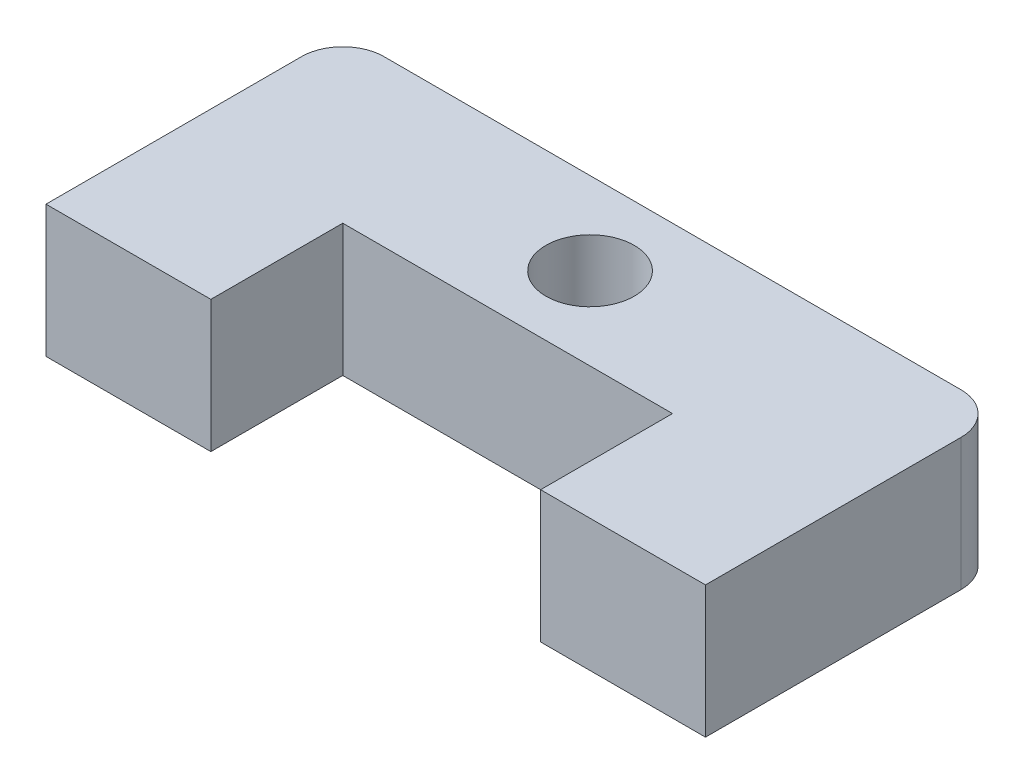
ISO-10303-21;
HEADER;
FILE_DESCRIPTION(('STEP AP214'),'2;1');
FILE_NAME('part.step','',(''),(''),'','','');
FILE_SCHEMA(('AUTOMOTIVE_DESIGN { 1 0 10303 214 1 1 1 1 }'));
ENDSEC;
DATA;
#1=APPLICATION_CONTEXT('core data for automotive mechanical design processes');
#2=APPLICATION_PROTOCOL_DEFINITION('international standard','automotive_design',2000,#1);
#3=PRODUCT_CONTEXT('',#1,'mechanical');
#4=PRODUCT('Part','Part','',(#3));
#5=PRODUCT_RELATED_PRODUCT_CATEGORY('part','',(#4));
#6=PRODUCT_DEFINITION_FORMATION('','',#4);
#7=PRODUCT_DEFINITION_CONTEXT('part definition',#1,'design');
#8=PRODUCT_DEFINITION('design','',#6,#7);
#9=PRODUCT_DEFINITION_SHAPE('','',#8);
#10=(LENGTH_UNIT() NAMED_UNIT(*) SI_UNIT(.MILLI.,.METRE.));
#11=(NAMED_UNIT(*) PLANE_ANGLE_UNIT() SI_UNIT($,.RADIAN.));
#12=(NAMED_UNIT(*) SI_UNIT($,.STERADIAN.) SOLID_ANGLE_UNIT());
#13=UNCERTAINTY_MEASURE_WITH_UNIT(LENGTH_MEASURE(1.E-05),#10,'distance_accuracy_value','');
#14=(GEOMETRIC_REPRESENTATION_CONTEXT(3) GLOBAL_UNCERTAINTY_ASSIGNED_CONTEXT((#13)) GLOBAL_UNIT_ASSIGNED_CONTEXT((#10,
#11,#12)) REPRESENTATION_CONTEXT('',''));
#15=CARTESIAN_POINT('',(0.,0.,0.));
#16=DIRECTION('',(0.,0.,1.));
#17=DIRECTION('',(1.,0.,0.));
#18=AXIS2_PLACEMENT_3D('',#15,#16,#17);
#19=CARTESIAN_POINT('',(0.,5.08,0.));
#20=DIRECTION('',(0.,-1.,0.));
#21=DIRECTION('',(0.,0.,-1.));
#22=AXIS2_PLACEMENT_3D('',#19,#20,#21);
#23=PLANE('',#22);
#24=DIRECTION('',(0.,0.,-1.));
#25=VECTOR('',#24,1.);
#26=CARTESIAN_POINT('',(12.7,5.08,3.175));
#27=LINE('',#26,#25);
#28=CARTESIAN_POINT('',(12.7,5.08,8.255));
#29=VERTEX_POINT('',#28);
#30=CARTESIAN_POINT('',(12.7,5.08,-1.5875));
#31=VERTEX_POINT('',#30);
#32=EDGE_CURVE('E162',#29,#31,#27,.T.);
#33=ORIENTED_EDGE('',*,*,#32,.T.);
#34=CARTESIAN_POINT('',(11.1125,5.08,-1.5875));
#35=DIRECTION('',(0.,-1.,0.));
#36=DIRECTION('',(0.,0.,-1.));
#37=AXIS2_PLACEMENT_3D('',#34,#35,#36);
#38=CIRCLE('',#37,1.5875);
#39=CARTESIAN_POINT('',(11.1125,5.08,-3.175));
#40=VERTEX_POINT('',#39);
#41=EDGE_CURVE('E41',#31,#40,#38,.F.);
#42=ORIENTED_EDGE('',*,*,#41,.T.);
#43=DIRECTION('',(-1.,0.,0.));
#44=VECTOR('',#43,1.);
#45=CARTESIAN_POINT('',(-12.7,5.08,-3.175));
#46=LINE('',#45,#44);
#47=CARTESIAN_POINT('',(-11.1125,5.08,-3.175));
#48=VERTEX_POINT('',#47);
#49=EDGE_CURVE('E117',#40,#48,#46,.T.);
#50=ORIENTED_EDGE('',*,*,#49,.T.);
#51=CARTESIAN_POINT('',(-11.1125,5.08,-1.5875));
#52=DIRECTION('',(0.,-1.,0.));
#53=DIRECTION('',(0.,0.,-1.));
#54=AXIS2_PLACEMENT_3D('',#51,#52,#53);
#55=CIRCLE('',#54,1.5875);
#56=CARTESIAN_POINT('',(-12.7,5.08,-1.5875));
#57=VERTEX_POINT('',#56);
#58=EDGE_CURVE('E48',#48,#57,#55,.F.);
#59=ORIENTED_EDGE('',*,*,#58,.T.);
#60=DIRECTION('',(0.,0.,1.));
#61=VECTOR('',#60,1.);
#62=CARTESIAN_POINT('',(-12.7,5.08,3.175));
#63=LINE('',#62,#61);
#64=CARTESIAN_POINT('',(-12.7,5.08,8.255));
#65=VERTEX_POINT('',#64);
#66=EDGE_CURVE('E109',#57,#65,#63,.T.);
#67=ORIENTED_EDGE('',*,*,#66,.T.);
#68=DIRECTION('',(1.,0.,0.));
#69=VECTOR('',#68,1.);
#70=CARTESIAN_POINT('',(-12.7,5.08,8.255));
#71=LINE('',#70,#69);
#72=CARTESIAN_POINT('',(-6.35,5.08,8.255));
#73=VERTEX_POINT('',#72);
#74=EDGE_CURVE('E113',#65,#73,#71,.T.);
#75=ORIENTED_EDGE('',*,*,#74,.T.);
#76=DIRECTION('',(0.,0.,-1.));
#77=VECTOR('',#76,1.);
#78=CARTESIAN_POINT('',(-6.35,5.08,8.255));
#79=LINE('',#78,#77);
#80=CARTESIAN_POINT('',(-6.35,5.08,3.175));
#81=VERTEX_POINT('',#80);
#82=EDGE_CURVE('E132',#73,#81,#79,.T.);
#83=ORIENTED_EDGE('',*,*,#82,.T.);
#84=DIRECTION('',(1.,0.,0.));
#85=VECTOR('',#84,1.);
#86=CARTESIAN_POINT('',(-6.35,5.08,3.175));
#87=LINE('',#86,#85);
#88=CARTESIAN_POINT('',(6.35,5.08,3.175));
#89=VERTEX_POINT('',#88);
#90=EDGE_CURVE('E134',#81,#89,#87,.T.);
#91=ORIENTED_EDGE('',*,*,#90,.T.);
#92=DIRECTION('',(0.,0.,1.));
#93=VECTOR('',#92,1.);
#94=CARTESIAN_POINT('',(6.35,5.08,3.175));
#95=LINE('',#94,#93);
#96=CARTESIAN_POINT('',(6.35,5.08,8.255));
#97=VERTEX_POINT('',#96);
#98=EDGE_CURVE('E139',#89,#97,#95,.T.);
#99=ORIENTED_EDGE('',*,*,#98,.T.);
#100=DIRECTION('',(1.,0.,0.));
#101=VECTOR('',#100,1.);
#102=CARTESIAN_POINT('',(6.35,5.08,8.255));
#103=LINE('',#102,#101);
#104=EDGE_CURVE('E141',#97,#29,#103,.T.);
#105=ORIENTED_EDGE('',*,*,#104,.T.);
#106=EDGE_LOOP('',(#33,#42,#50,#59,#67,#75,#83,#91,#99,#105));
#107=FACE_BOUND('',#106,.T.);
#108=CARTESIAN_POINT('',(0.,5.08,0.));
#109=DIRECTION('',(0.,1.,0.));
#110=DIRECTION('',(0.,0.,1.));
#111=AXIS2_PLACEMENT_3D('',#108,#109,#110);
#112=CIRCLE('',#111,1.7);
#113=CARTESIAN_POINT('',(0.,5.08,1.7));
#114=VERTEX_POINT('',#113);
#115=EDGE_CURVE('E148',#114,#114,#112,.T.);
#116=ORIENTED_EDGE('',*,*,#115,.F.);
#117=EDGE_LOOP('',(#116));
#118=FACE_BOUND('',#117,.T.);
#119=ADVANCED_FACE('F33',(#107,#118),#23,.F.);
#120=CARTESIAN_POINT('',(0.,0.,0.));
#121=DIRECTION('',(0.,-1.,0.));
#122=DIRECTION('',(0.,0.,-1.));
#123=AXIS2_PLACEMENT_3D('',#120,#121,#122);
#124=PLANE('',#123);
#125=DIRECTION('',(-1.,0.,0.));
#126=VECTOR('',#125,1.);
#127=CARTESIAN_POINT('',(-12.7,0.,-3.175));
#128=LINE('',#127,#126);
#129=CARTESIAN_POINT('',(11.1125,0.,-3.175));
#130=VERTEX_POINT('',#129);
#131=CARTESIAN_POINT('',(-11.1125,0.,-3.175));
#132=VERTEX_POINT('',#131);
#133=EDGE_CURVE('E145',#130,#132,#128,.T.);
#134=ORIENTED_EDGE('',*,*,#133,.F.);
#135=CARTESIAN_POINT('',(11.1125,0.,-1.5875));
#136=DIRECTION('',(0.,-1.,0.));
#137=DIRECTION('',(0.,0.,-1.));
#138=AXIS2_PLACEMENT_3D('',#135,#136,#137);
#139=CIRCLE('',#138,1.5875);
#140=CARTESIAN_POINT('',(12.7,0.,-1.5875));
#141=VERTEX_POINT('',#140);
#142=EDGE_CURVE('E181',#130,#141,#139,.T.);
#143=ORIENTED_EDGE('',*,*,#142,.T.);
#144=DIRECTION('',(0.,0.,-1.));
#145=VECTOR('',#144,1.);
#146=CARTESIAN_POINT('',(12.7,0.,8.255));
#147=LINE('',#146,#145);
#148=CARTESIAN_POINT('',(12.7,0.,8.255));
#149=VERTEX_POINT('',#148);
#150=EDGE_CURVE('E160',#149,#141,#147,.T.);
#151=ORIENTED_EDGE('',*,*,#150,.F.);
#152=DIRECTION('',(1.,0.,0.));
#153=VECTOR('',#152,1.);
#154=CARTESIAN_POINT('',(6.35,0.,8.255));
#155=LINE('',#154,#153);
#156=CARTESIAN_POINT('',(6.35,0.,8.255));
#157=VERTEX_POINT('',#156);
#158=EDGE_CURVE('E158',#157,#149,#155,.T.);
#159=ORIENTED_EDGE('',*,*,#158,.F.);
#160=DIRECTION('',(0.,0.,1.));
#161=VECTOR('',#160,1.);
#162=CARTESIAN_POINT('',(6.35,0.,3.175));
#163=LINE('',#162,#161);
#164=CARTESIAN_POINT('',(6.35,0.,3.175));
#165=VERTEX_POINT('',#164);
#166=EDGE_CURVE('E156',#165,#157,#163,.T.);
#167=ORIENTED_EDGE('',*,*,#166,.F.);
#168=DIRECTION('',(1.,0.,0.));
#169=VECTOR('',#168,1.);
#170=CARTESIAN_POINT('',(-6.35,0.,3.175));
#171=LINE('',#170,#169);
#172=CARTESIAN_POINT('',(-6.35,0.,3.175));
#173=VERTEX_POINT('',#172);
#174=EDGE_CURVE('E154',#173,#165,#171,.T.);
#175=ORIENTED_EDGE('',*,*,#174,.F.);
#176=DIRECTION('',(0.,0.,-1.));
#177=VECTOR('',#176,1.);
#178=CARTESIAN_POINT('',(-6.35,0.,8.255));
#179=LINE('',#178,#177);
#180=CARTESIAN_POINT('',(-6.35,0.,8.255));
#181=VERTEX_POINT('',#180);
#182=EDGE_CURVE('E152',#181,#173,#179,.T.);
#183=ORIENTED_EDGE('',*,*,#182,.F.);
#184=DIRECTION('',(1.,0.,0.));
#185=VECTOR('',#184,1.);
#186=CARTESIAN_POINT('',(-12.7,0.,8.255));
#187=LINE('',#186,#185);
#188=CARTESIAN_POINT('',(-12.7,0.,8.255));
#189=VERTEX_POINT('',#188);
#190=EDGE_CURVE('E150',#189,#181,#187,.T.);
#191=ORIENTED_EDGE('',*,*,#190,.F.);
#192=DIRECTION('',(0.,0.,1.));
#193=VECTOR('',#192,1.);
#194=CARTESIAN_POINT('',(-12.7,0.,3.175));
#195=LINE('',#194,#193);
#196=CARTESIAN_POINT('',(-12.7,0.,-1.5875));
#197=VERTEX_POINT('',#196);
#198=EDGE_CURVE('E123',#197,#189,#195,.T.);
#199=ORIENTED_EDGE('',*,*,#198,.F.);
#200=CARTESIAN_POINT('',(-11.1125,0.,-1.5875));
#201=DIRECTION('',(0.,-1.,0.));
#202=DIRECTION('',(0.,0.,-1.));
#203=AXIS2_PLACEMENT_3D('',#200,#201,#202);
#204=CIRCLE('',#203,1.5875);
#205=EDGE_CURVE('E179',#197,#132,#204,.T.);
#206=ORIENTED_EDGE('',*,*,#205,.T.);
#207=EDGE_LOOP('',(#134,#143,#151,#159,#167,#175,#183,#191,#199,#206));
#208=FACE_BOUND('',#207,.T.);
#209=CARTESIAN_POINT('',(0.,0.,0.));
#210=DIRECTION('',(0.,1.,0.));
#211=DIRECTION('',(0.,0.,1.));
#212=AXIS2_PLACEMENT_3D('',#209,#210,#211);
#213=CIRCLE('',#212,1.7);
#214=CARTESIAN_POINT('',(0.,0.,1.7));
#215=VERTEX_POINT('',#214);
#216=EDGE_CURVE('E333',#215,#215,#213,.T.);
#217=ORIENTED_EDGE('',*,*,#216,.T.);
#218=EDGE_LOOP('',(#217));
#219=FACE_BOUND('',#218,.T.);
#220=ADVANCED_FACE('F195',(#208,#219),#124,.T.);
#221=CARTESIAN_POINT('',(-12.7,5.08,-3.175));
#222=DIRECTION('',(0.,0.,1.));
#223=DIRECTION('',(1.,0.,0.));
#224=AXIS2_PLACEMENT_3D('',#221,#222,#223);
#225=PLANE('',#224);
#226=ORIENTED_EDGE('',*,*,#49,.F.);
#227=DIRECTION('',(0.,-1.,0.));
#228=VECTOR('',#227,1.);
#229=CARTESIAN_POINT('',(11.1125,5.08,-3.175));
#230=LINE('',#229,#228);
#231=EDGE_CURVE('E176',#40,#130,#230,.T.);
#232=ORIENTED_EDGE('',*,*,#231,.T.);
#233=ORIENTED_EDGE('',*,*,#133,.T.);
#234=DIRECTION('',(0.,-1.,0.));
#235=VECTOR('',#234,1.);
#236=CARTESIAN_POINT('',(-11.1125,5.08,-3.175));
#237=LINE('',#236,#235);
#238=EDGE_CURVE('E126',#132,#48,#237,.F.);
#239=ORIENTED_EDGE('',*,*,#238,.T.);
#240=EDGE_LOOP('',(#226,#232,#233,#239));
#241=FACE_BOUND('',#240,.T.);
#242=ADVANCED_FACE('F189',(#241),#225,.F.);
#243=CARTESIAN_POINT('',(-12.7,5.08,3.175));
#244=DIRECTION('',(1.,0.,0.));
#245=DIRECTION('',(0.,0.,-1.));
#246=AXIS2_PLACEMENT_3D('',#243,#244,#245);
#247=PLANE('',#246);
#248=ORIENTED_EDGE('',*,*,#66,.F.);
#249=DIRECTION('',(0.,-1.,0.));
#250=VECTOR('',#249,1.);
#251=CARTESIAN_POINT('',(-12.7,5.08,-1.5875));
#252=LINE('',#251,#250);
#253=EDGE_CURVE('E11',#57,#197,#252,.T.);
#254=ORIENTED_EDGE('',*,*,#253,.T.);
#255=ORIENTED_EDGE('',*,*,#198,.T.);
#256=DIRECTION('',(0.,-1.,0.));
#257=VECTOR('',#256,1.);
#258=CARTESIAN_POINT('',(-12.7,5.08,8.255));
#259=LINE('',#258,#257);
#260=EDGE_CURVE('E120',#65,#189,#259,.T.);
#261=ORIENTED_EDGE('',*,*,#260,.F.);
#262=EDGE_LOOP('',(#248,#254,#255,#261));
#263=FACE_BOUND('',#262,.T.);
#264=ADVANCED_FACE('F121',(#263),#247,.F.);
#265=CARTESIAN_POINT('',(-12.7,5.08,8.255));
#266=DIRECTION('',(0.,0.,-1.));
#267=DIRECTION('',(-1.,0.,0.));
#268=AXIS2_PLACEMENT_3D('',#265,#266,#267);
#269=PLANE('',#268);
#270=ORIENTED_EDGE('',*,*,#190,.T.);
#271=DIRECTION('',(0.,-1.,0.));
#272=VECTOR('',#271,1.);
#273=CARTESIAN_POINT('',(-6.35,5.08,8.255));
#274=LINE('',#273,#272);
#275=EDGE_CURVE('E127',#73,#181,#274,.T.);
#276=ORIENTED_EDGE('',*,*,#275,.F.);
#277=ORIENTED_EDGE('',*,*,#74,.F.);
#278=ORIENTED_EDGE('',*,*,#260,.T.);
#279=EDGE_LOOP('',(#270,#276,#277,#278));
#280=FACE_BOUND('',#279,.T.);
#281=ADVANCED_FACE('F129',(#280),#269,.F.);
#282=CARTESIAN_POINT('',(-6.35,5.08,8.255));
#283=DIRECTION('',(-1.,0.,0.));
#284=DIRECTION('',(0.,0.,1.));
#285=AXIS2_PLACEMENT_3D('',#282,#283,#284);
#286=PLANE('',#285);
#287=ORIENTED_EDGE('',*,*,#182,.T.);
#288=DIRECTION('',(0.,-1.,0.));
#289=VECTOR('',#288,1.);
#290=CARTESIAN_POINT('',(-6.35,5.08,3.175));
#291=LINE('',#290,#289);
#292=EDGE_CURVE('E171',#81,#173,#291,.T.);
#293=ORIENTED_EDGE('',*,*,#292,.F.);
#294=ORIENTED_EDGE('',*,*,#82,.F.);
#295=ORIENTED_EDGE('',*,*,#275,.T.);
#296=EDGE_LOOP('',(#287,#293,#294,#295));
#297=FACE_BOUND('',#296,.T.);
#298=ADVANCED_FACE('F216',(#297),#286,.F.);
#299=CARTESIAN_POINT('',(-6.35,5.08,3.175));
#300=DIRECTION('',(0.,0.,-1.));
#301=DIRECTION('',(-1.,0.,0.));
#302=AXIS2_PLACEMENT_3D('',#299,#300,#301);
#303=PLANE('',#302);
#304=ORIENTED_EDGE('',*,*,#174,.T.);
#305=DIRECTION('',(0.,-1.,0.));
#306=VECTOR('',#305,1.);
#307=CARTESIAN_POINT('',(6.35,5.08,3.175));
#308=LINE('',#307,#306);
#309=EDGE_CURVE('E168',#89,#165,#308,.T.);
#310=ORIENTED_EDGE('',*,*,#309,.F.);
#311=ORIENTED_EDGE('',*,*,#90,.F.);
#312=ORIENTED_EDGE('',*,*,#292,.T.);
#313=EDGE_LOOP('',(#304,#310,#311,#312));
#314=FACE_BOUND('',#313,.T.);
#315=ADVANCED_FACE('F213',(#314),#303,.F.);
#316=CARTESIAN_POINT('',(6.35,5.08,3.175));
#317=DIRECTION('',(1.,0.,0.));
#318=DIRECTION('',(0.,0.,-1.));
#319=AXIS2_PLACEMENT_3D('',#316,#317,#318);
#320=PLANE('',#319);
#321=ORIENTED_EDGE('',*,*,#166,.T.);
#322=DIRECTION('',(0.,-1.,0.));
#323=VECTOR('',#322,1.);
#324=CARTESIAN_POINT('',(6.35,5.08,8.255));
#325=LINE('',#324,#323);
#326=EDGE_CURVE('E165',#97,#157,#325,.T.);
#327=ORIENTED_EDGE('',*,*,#326,.F.);
#328=ORIENTED_EDGE('',*,*,#98,.F.);
#329=ORIENTED_EDGE('',*,*,#309,.T.);
#330=EDGE_LOOP('',(#321,#327,#328,#329));
#331=FACE_BOUND('',#330,.T.);
#332=ADVANCED_FACE('F208',(#331),#320,.F.);
#333=CARTESIAN_POINT('',(6.35,5.08,8.255));
#334=DIRECTION('',(0.,0.,-1.));
#335=DIRECTION('',(-1.,0.,0.));
#336=AXIS2_PLACEMENT_3D('',#333,#334,#335);
#337=PLANE('',#336);
#338=ORIENTED_EDGE('',*,*,#158,.T.);
#339=DIRECTION('',(0.,-1.,0.));
#340=VECTOR('',#339,1.);
#341=CARTESIAN_POINT('',(12.7,5.08,8.255));
#342=LINE('',#341,#340);
#343=EDGE_CURVE('E144',#29,#149,#342,.T.);
#344=ORIENTED_EDGE('',*,*,#343,.F.);
#345=ORIENTED_EDGE('',*,*,#104,.F.);
#346=ORIENTED_EDGE('',*,*,#326,.T.);
#347=EDGE_LOOP('',(#338,#344,#345,#346));
#348=FACE_BOUND('',#347,.T.);
#349=ADVANCED_FACE('F202',(#348),#337,.F.);
#350=CARTESIAN_POINT('',(12.7,5.08,8.255));
#351=DIRECTION('',(-1.,0.,0.));
#352=DIRECTION('',(0.,0.,1.));
#353=AXIS2_PLACEMENT_3D('',#350,#351,#352);
#354=PLANE('',#353);
#355=ORIENTED_EDGE('',*,*,#150,.T.);
#356=DIRECTION('',(0.,-1.,0.));
#357=VECTOR('',#356,1.);
#358=CARTESIAN_POINT('',(12.7,5.08,-1.5875));
#359=LINE('',#358,#357);
#360=EDGE_CURVE('E56',#141,#31,#359,.F.);
#361=ORIENTED_EDGE('',*,*,#360,.T.);
#362=ORIENTED_EDGE('',*,*,#32,.F.);
#363=ORIENTED_EDGE('',*,*,#343,.T.);
#364=EDGE_LOOP('',(#355,#361,#362,#363));
#365=FACE_BOUND('',#364,.T.);
#366=ADVANCED_FACE('F198',(#365),#354,.F.);
#367=CARTESIAN_POINT('',(0.,5.08,0.));
#368=DIRECTION('',(0.,-1.,0.));
#369=DIRECTION('',(0.,0.,-1.));
#370=AXIS2_PLACEMENT_3D('',#367,#368,#369);
#371=CYLINDRICAL_SURFACE('',#370,1.7);
#372=ORIENTED_EDGE('',*,*,#115,.T.);
#373=EDGE_LOOP('',(#372));
#374=FACE_BOUND('',#373,.T.);
#375=ORIENTED_EDGE('',*,*,#216,.F.);
#376=EDGE_LOOP('',(#375));
#377=FACE_BOUND('',#376,.T.);
#378=ADVANCED_FACE('F222',(#374,#377),#371,.F.);
#379=CARTESIAN_POINT('',(11.1125,5.08,-1.5875));
#380=DIRECTION('',(0.,-1.,0.));
#381=DIRECTION('',(0.,0.,-1.));
#382=AXIS2_PLACEMENT_3D('',#379,#380,#381);
#383=CYLINDRICAL_SURFACE('',#382,1.5875);
#384=ORIENTED_EDGE('',*,*,#41,.F.);
#385=ORIENTED_EDGE('',*,*,#360,.F.);
#386=ORIENTED_EDGE('',*,*,#142,.F.);
#387=ORIENTED_EDGE('',*,*,#231,.F.);
#388=EDGE_LOOP('',(#384,#385,#386,#387));
#389=FACE_BOUND('',#388,.T.);
#390=ADVANCED_FACE('F192',(#389),#383,.T.);
#391=CARTESIAN_POINT('',(-11.1125,5.08,-1.5875));
#392=DIRECTION('',(0.,-1.,0.));
#393=DIRECTION('',(0.,0.,-1.));
#394=AXIS2_PLACEMENT_3D('',#391,#392,#393);
#395=CYLINDRICAL_SURFACE('',#394,1.5875);
#396=ORIENTED_EDGE('',*,*,#58,.F.);
#397=ORIENTED_EDGE('',*,*,#238,.F.);
#398=ORIENTED_EDGE('',*,*,#205,.F.);
#399=ORIENTED_EDGE('',*,*,#253,.F.);
#400=EDGE_LOOP('',(#396,#397,#398,#399));
#401=FACE_BOUND('',#400,.T.);
#402=ADVANCED_FACE('F35',(#401),#395,.T.);
#403=CLOSED_SHELL('',(#119,#220,#242,#264,#281,#298,#315,#332,#349,#366,#378,#390,#402));
#404=MANIFOLD_SOLID_BREP('B2',#403);
#405=ADVANCED_BREP_SHAPE_REPRESENTATION('',(#18,#404),#14);
#406=SHAPE_DEFINITION_REPRESENTATION(#9,#405);
ENDSEC;
END-ISO-10303-21;
